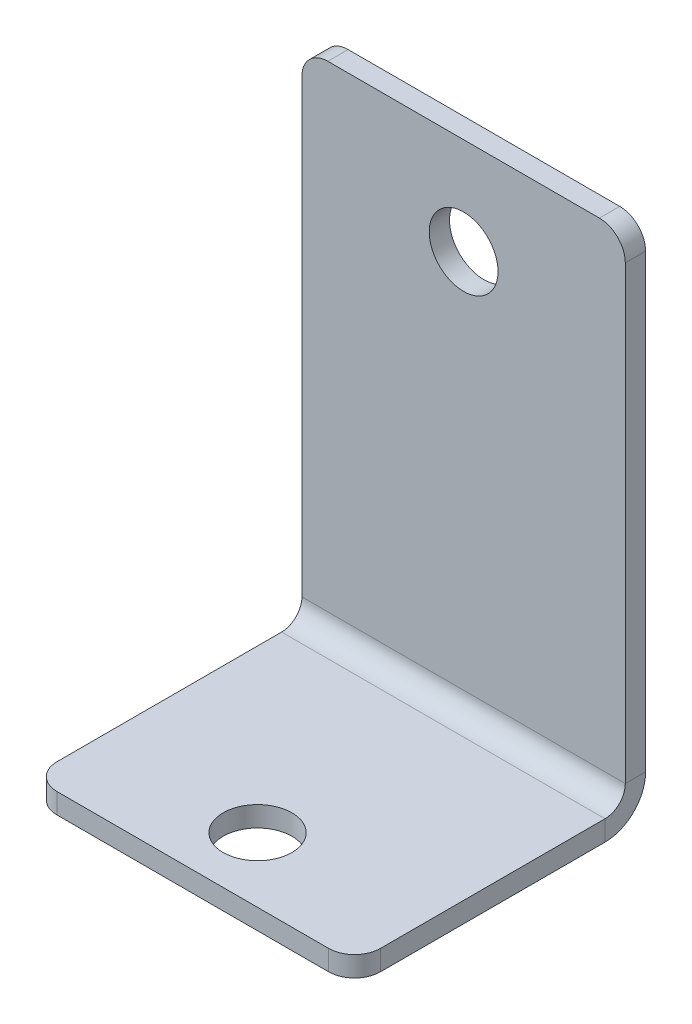
ISO-10303-21;
HEADER;
FILE_DESCRIPTION(('STEP AP214'),'2;1');
FILE_NAME('part.step','',(''),(''),'','','');
FILE_SCHEMA(('AUTOMOTIVE_DESIGN { 1 0 10303 214 1 1 1 1 }'));
ENDSEC;
DATA;
#1=APPLICATION_CONTEXT('core data for automotive mechanical design processes');
#2=APPLICATION_PROTOCOL_DEFINITION('international standard','automotive_design',2000,#1);
#3=PRODUCT_CONTEXT('',#1,'mechanical');
#4=PRODUCT('Part','Part','',(#3));
#5=PRODUCT_RELATED_PRODUCT_CATEGORY('part','',(#4));
#6=PRODUCT_DEFINITION_FORMATION('','',#4);
#7=PRODUCT_DEFINITION_CONTEXT('part definition',#1,'design');
#8=PRODUCT_DEFINITION('design','',#6,#7);
#9=PRODUCT_DEFINITION_SHAPE('','',#8);
#10=(LENGTH_UNIT() NAMED_UNIT(*) SI_UNIT(.MILLI.,.METRE.));
#11=(NAMED_UNIT(*) PLANE_ANGLE_UNIT() SI_UNIT($,.RADIAN.));
#12=(NAMED_UNIT(*) SI_UNIT($,.STERADIAN.) SOLID_ANGLE_UNIT());
#13=UNCERTAINTY_MEASURE_WITH_UNIT(LENGTH_MEASURE(1.E-05),#10,'distance_accuracy_value','');
#14=(GEOMETRIC_REPRESENTATION_CONTEXT(3) GLOBAL_UNCERTAINTY_ASSIGNED_CONTEXT((#13)) GLOBAL_UNIT_ASSIGNED_CONTEXT((#10,
#11,#12)) REPRESENTATION_CONTEXT('',''));
#15=CARTESIAN_POINT('',(0.,0.,0.));
#16=DIRECTION('',(0.,0.,1.));
#17=DIRECTION('',(1.,0.,0.));
#18=AXIS2_PLACEMENT_3D('',#15,#16,#17);
#19=CARTESIAN_POINT('',(31.75,0.,3.9878));
#20=DIRECTION('',(1.,0.,0.));
#21=DIRECTION('',(0.,0.,-1.));
#22=AXIS2_PLACEMENT_3D('',#19,#20,#21);
#23=PLANE('',#22);
#24=DIRECTION('',(0.,1.,0.));
#25=VECTOR('',#24,1.);
#26=CARTESIAN_POINT('',(31.75,0.,3.9878));
#27=LINE('',#26,#25);
#28=CARTESIAN_POINT('',(31.75,0.,3.9878));
#29=VERTEX_POINT('',#28);
#30=CARTESIAN_POINT('',(31.75,1.9939,3.9878));
#31=VERTEX_POINT('',#30);
#32=EDGE_CURVE('E141',#29,#31,#27,.T.);
#33=ORIENTED_EDGE('',*,*,#32,.F.);
#34=CARTESIAN_POINT('',(31.75,3.9878,3.9878));
#35=DIRECTION('',(-1.,0.,0.));
#36=DIRECTION('',(0.,0.,1.));
#37=AXIS2_PLACEMENT_3D('',#34,#35,#36);
#38=CIRCLE('',#37,3.9878);
#39=CARTESIAN_POINT('',(31.75,3.9878,0.));
#40=VERTEX_POINT('',#39);
#41=EDGE_CURVE('E138',#29,#40,#38,.F.);
#42=ORIENTED_EDGE('',*,*,#41,.T.);
#43=DIRECTION('',(0.,0.,-1.));
#44=VECTOR('',#43,1.);
#45=CARTESIAN_POINT('',(31.75,3.9878,1.9939));
#46=LINE('',#45,#44);
#47=CARTESIAN_POINT('',(31.75,3.9878,1.9939));
#48=VERTEX_POINT('',#47);
#49=EDGE_CURVE('E132',#48,#40,#46,.T.);
#50=ORIENTED_EDGE('',*,*,#49,.F.);
#51=CARTESIAN_POINT('',(31.75,3.9878,3.9878));
#52=DIRECTION('',(1.,0.,0.));
#53=DIRECTION('',(0.,0.,-1.));
#54=AXIS2_PLACEMENT_3D('',#51,#52,#53);
#55=CIRCLE('',#54,1.9939);
#56=EDGE_CURVE('E136',#31,#48,#55,.T.);
#57=ORIENTED_EDGE('',*,*,#56,.F.);
#58=EDGE_LOOP('',(#33,#42,#50,#57));
#59=FACE_BOUND('',#58,.T.);
#60=ADVANCED_FACE('F40',(#59),#23,.T.);
#61=CARTESIAN_POINT('',(31.75,3.9878,1.9939));
#62=DIRECTION('',(1.,0.,0.));
#63=DIRECTION('',(0.,0.,-1.));
#64=AXIS2_PLACEMENT_3D('',#61,#62,#63);
#65=PLANE('',#64);
#66=DIRECTION('',(0.,0.,-1.));
#67=VECTOR('',#66,1.);
#68=CARTESIAN_POINT('',(31.75,1.9939,28.575));
#69=LINE('',#68,#67);
#70=CARTESIAN_POINT('',(31.75,1.9939,26.035));
#71=VERTEX_POINT('',#70);
#72=EDGE_CURVE('E168',#71,#31,#69,.T.);
#73=ORIENTED_EDGE('',*,*,#72,.F.);
#74=DIRECTION('',(0.,1.,0.));
#75=VECTOR('',#74,1.);
#76=CARTESIAN_POINT('',(31.75,3.9878,26.035));
#77=LINE('',#76,#75);
#78=CARTESIAN_POINT('',(31.75,0.,26.035));
#79=VERTEX_POINT('',#78);
#80=EDGE_CURVE('E245',#71,#79,#77,.F.);
#81=ORIENTED_EDGE('',*,*,#80,.T.);
#82=DIRECTION('',(0.,0.,-1.));
#83=VECTOR('',#82,1.);
#84=CARTESIAN_POINT('',(31.75,0.,28.575));
#85=LINE('',#84,#83);
#86=EDGE_CURVE('E172',#79,#29,#85,.T.);
#87=ORIENTED_EDGE('',*,*,#86,.T.);
#88=ORIENTED_EDGE('',*,*,#32,.T.);
#89=EDGE_LOOP('',(#73,#81,#87,#88));
#90=FACE_BOUND('',#89,.T.);
#91=ADVANCED_FACE('F344',(#90),#65,.T.);
#92=CARTESIAN_POINT('',(0.,3.9878,0.));
#93=DIRECTION('',(-1.,0.,0.));
#94=DIRECTION('',(0.,0.,1.));
#95=AXIS2_PLACEMENT_3D('',#92,#93,#94);
#96=PLANE('',#95);
#97=DIRECTION('',(0.,0.,1.));
#98=VECTOR('',#97,1.);
#99=CARTESIAN_POINT('',(0.,3.9878,0.));
#100=LINE('',#99,#98);
#101=CARTESIAN_POINT('',(0.,3.9878,0.));
#102=VERTEX_POINT('',#101);
#103=CARTESIAN_POINT('',(0.,3.9878,1.9939));
#104=VERTEX_POINT('',#103);
#105=EDGE_CURVE('E142',#102,#104,#100,.T.);
#106=ORIENTED_EDGE('',*,*,#105,.F.);
#107=CARTESIAN_POINT('',(0.,3.9878,3.9878));
#108=DIRECTION('',(-1.,0.,0.));
#109=DIRECTION('',(0.,0.,1.));
#110=AXIS2_PLACEMENT_3D('',#107,#108,#109);
#111=CIRCLE('',#110,3.9878);
#112=CARTESIAN_POINT('',(0.,0.,3.9878));
#113=VERTEX_POINT('',#112);
#114=EDGE_CURVE('E197',#113,#102,#111,.F.);
#115=ORIENTED_EDGE('',*,*,#114,.F.);
#116=DIRECTION('',(0.,-1.,0.));
#117=VECTOR('',#116,1.);
#118=CARTESIAN_POINT('',(0.,1.9939,3.9878));
#119=LINE('',#118,#117);
#120=CARTESIAN_POINT('',(0.,1.9939,3.9878));
#121=VERTEX_POINT('',#120);
#122=EDGE_CURVE('E223',#121,#113,#119,.T.);
#123=ORIENTED_EDGE('',*,*,#122,.F.);
#124=CARTESIAN_POINT('',(0.,3.9878,3.9878));
#125=DIRECTION('',(1.,0.,0.));
#126=DIRECTION('',(0.,0.,-1.));
#127=AXIS2_PLACEMENT_3D('',#124,#125,#126);
#128=CIRCLE('',#127,1.9939);
#129=EDGE_CURVE('E188',#121,#104,#128,.T.);
#130=ORIENTED_EDGE('',*,*,#129,.T.);
#131=EDGE_LOOP('',(#106,#115,#123,#130));
#132=FACE_BOUND('',#131,.T.);
#133=ADVANCED_FACE('F342',(#132),#96,.T.);
#134=CARTESIAN_POINT('',(0.,1.9939,3.9878));
#135=DIRECTION('',(-1.,0.,0.));
#136=DIRECTION('',(0.,0.,1.));
#137=AXIS2_PLACEMENT_3D('',#134,#135,#136);
#138=PLANE('',#137);
#139=DIRECTION('',(0.,1.,0.));
#140=VECTOR('',#139,1.);
#141=CARTESIAN_POINT('',(0.,0.,1.9939));
#142=LINE('',#141,#140);
#143=CARTESIAN_POINT('',(0.,48.26,1.9939));
#144=VERTEX_POINT('',#143);
#145=EDGE_CURVE('E152',#104,#144,#142,.T.);
#146=ORIENTED_EDGE('',*,*,#145,.T.);
#147=DIRECTION('',(0.,0.,-1.));
#148=VECTOR('',#147,1.);
#149=CARTESIAN_POINT('',(0.,48.26,3.9878));
#150=LINE('',#149,#148);
#151=CARTESIAN_POINT('',(0.,48.26,0.));
#152=VERTEX_POINT('',#151);
#153=EDGE_CURVE('E258',#144,#152,#150,.T.);
#154=ORIENTED_EDGE('',*,*,#153,.T.);
#155=DIRECTION('',(0.,1.,0.));
#156=VECTOR('',#155,1.);
#157=CARTESIAN_POINT('',(0.,0.,0.));
#158=LINE('',#157,#156);
#159=EDGE_CURVE('E181',#102,#152,#158,.T.);
#160=ORIENTED_EDGE('',*,*,#159,.F.);
#161=ORIENTED_EDGE('',*,*,#105,.T.);
#162=EDGE_LOOP('',(#146,#154,#160,#161));
#163=FACE_BOUND('',#162,.T.);
#164=ADVANCED_FACE('F282',(#163),#138,.T.);
#165=CARTESIAN_POINT('',(31.75,0.,0.));
#166=DIRECTION('',(0.,0.,1.));
#167=DIRECTION('',(1.,0.,0.));
#168=AXIS2_PLACEMENT_3D('',#165,#166,#167);
#169=PLANE('',#168);
#170=CARTESIAN_POINT('',(15.875,41.275,0.));
#171=DIRECTION('',(0.,0.,1.));
#172=DIRECTION('',(1.,0.,0.));
#173=AXIS2_PLACEMENT_3D('',#170,#171,#172);
#174=CIRCLE('',#173,3.37819999999993);
#175=CARTESIAN_POINT('',(19.2531999999999,41.275,0.));
#176=VERTEX_POINT('',#175);
#177=EDGE_CURVE('E185',#176,#176,#174,.T.);
#178=ORIENTED_EDGE('',*,*,#177,.T.);
#179=EDGE_LOOP('',(#178));
#180=FACE_BOUND('',#179,.T.);
#181=ORIENTED_EDGE('',*,*,#159,.T.);
#182=CARTESIAN_POINT('',(2.54,48.26,0.));
#183=DIRECTION('',(0.,0.,1.));
#184=DIRECTION('',(1.,0.,0.));
#185=AXIS2_PLACEMENT_3D('',#182,#183,#184);
#186=CIRCLE('',#185,2.54);
#187=CARTESIAN_POINT('',(2.54,50.8,0.));
#188=VERTEX_POINT('',#187);
#189=EDGE_CURVE('E265',#152,#188,#186,.F.);
#190=ORIENTED_EDGE('',*,*,#189,.T.);
#191=DIRECTION('',(-1.,0.,0.));
#192=VECTOR('',#191,1.);
#193=CARTESIAN_POINT('',(31.75,50.8,0.));
#194=LINE('',#193,#192);
#195=CARTESIAN_POINT('',(29.21,50.8,0.));
#196=VERTEX_POINT('',#195);
#197=EDGE_CURVE('E220',#196,#188,#194,.T.);
#198=ORIENTED_EDGE('',*,*,#197,.F.);
#199=CARTESIAN_POINT('',(29.21,48.26,0.));
#200=DIRECTION('',(0.,0.,1.));
#201=DIRECTION('',(1.,0.,0.));
#202=AXIS2_PLACEMENT_3D('',#199,#200,#201);
#203=CIRCLE('',#202,2.54);
#204=CARTESIAN_POINT('',(31.75,48.26,0.));
#205=VERTEX_POINT('',#204);
#206=EDGE_CURVE('E262',#196,#205,#203,.F.);
#207=ORIENTED_EDGE('',*,*,#206,.T.);
#208=DIRECTION('',(0.,1.,0.));
#209=VECTOR('',#208,1.);
#210=CARTESIAN_POINT('',(31.75,0.,0.));
#211=LINE('',#210,#209);
#212=EDGE_CURVE('E162',#40,#205,#211,.T.);
#213=ORIENTED_EDGE('',*,*,#212,.F.);
#214=DIRECTION('',(-1.,0.,0.));
#215=VECTOR('',#214,1.);
#216=CARTESIAN_POINT('',(31.75,3.9878,0.));
#217=LINE('',#216,#215);
#218=EDGE_CURVE('E180',#40,#102,#217,.T.);
#219=ORIENTED_EDGE('',*,*,#218,.T.);
#220=EDGE_LOOP('',(#181,#190,#198,#207,#213,#219));
#221=FACE_BOUND('',#220,.T.);
#222=ADVANCED_FACE('F287',(#180,#221),#169,.F.);
#223=CARTESIAN_POINT('',(31.75,50.8,1.9939));
#224=DIRECTION('',(0.,1.,0.));
#225=DIRECTION('',(0.,0.,1.));
#226=AXIS2_PLACEMENT_3D('',#223,#224,#225);
#227=PLANE('',#226);
#228=ORIENTED_EDGE('',*,*,#197,.T.);
#229=DIRECTION('',(0.,0.,-1.));
#230=VECTOR('',#229,1.);
#231=CARTESIAN_POINT('',(2.54,50.8,1.9939));
#232=LINE('',#231,#230);
#233=CARTESIAN_POINT('',(2.54,50.8,1.9939));
#234=VERTEX_POINT('',#233);
#235=EDGE_CURVE('E62',#188,#234,#232,.F.);
#236=ORIENTED_EDGE('',*,*,#235,.T.);
#237=DIRECTION('',(-1.,0.,0.));
#238=VECTOR('',#237,1.);
#239=CARTESIAN_POINT('',(31.75,50.8,1.9939));
#240=LINE('',#239,#238);
#241=CARTESIAN_POINT('',(29.21,50.8,1.9939));
#242=VERTEX_POINT('',#241);
#243=EDGE_CURVE('E157',#242,#234,#240,.T.);
#244=ORIENTED_EDGE('',*,*,#243,.F.);
#245=DIRECTION('',(0.,0.,-1.));
#246=VECTOR('',#245,1.);
#247=CARTESIAN_POINT('',(29.21,50.8,1.9939));
#248=LINE('',#247,#246);
#249=EDGE_CURVE('E268',#242,#196,#248,.T.);
#250=ORIENTED_EDGE('',*,*,#249,.T.);
#251=EDGE_LOOP('',(#228,#236,#244,#250));
#252=FACE_BOUND('',#251,.T.);
#253=ADVANCED_FACE('F288',(#252),#227,.T.);
#254=CARTESIAN_POINT('',(31.75,0.,1.9939));
#255=DIRECTION('',(0.,0.,1.));
#256=DIRECTION('',(1.,0.,0.));
#257=AXIS2_PLACEMENT_3D('',#254,#255,#256);
#258=PLANE('',#257);
#259=CARTESIAN_POINT('',(15.875,41.275,1.9939));
#260=DIRECTION('',(0.,0.,1.));
#261=DIRECTION('',(1.,0.,0.));
#262=AXIS2_PLACEMENT_3D('',#259,#260,#261);
#263=CIRCLE('',#262,3.37819999999993);
#264=CARTESIAN_POINT('',(19.2531999999999,41.275,1.9939));
#265=VERTEX_POINT('',#264);
#266=EDGE_CURVE('E298',#265,#265,#263,.T.);
#267=ORIENTED_EDGE('',*,*,#266,.F.);
#268=EDGE_LOOP('',(#267));
#269=FACE_BOUND('',#268,.T.);
#270=ORIENTED_EDGE('',*,*,#243,.T.);
#271=CARTESIAN_POINT('',(2.54,48.26,1.9939));
#272=DIRECTION('',(0.,0.,1.));
#273=DIRECTION('',(1.,0.,0.));
#274=AXIS2_PLACEMENT_3D('',#271,#272,#273);
#275=CIRCLE('',#274,2.54);
#276=EDGE_CURVE('E49',#234,#144,#275,.T.);
#277=ORIENTED_EDGE('',*,*,#276,.T.);
#278=ORIENTED_EDGE('',*,*,#145,.F.);
#279=DIRECTION('',(-1.,0.,0.));
#280=VECTOR('',#279,1.);
#281=CARTESIAN_POINT('',(31.75,3.9878,1.9939));
#282=LINE('',#281,#280);
#283=EDGE_CURVE('E147',#48,#104,#282,.T.);
#284=ORIENTED_EDGE('',*,*,#283,.F.);
#285=DIRECTION('',(0.,1.,0.));
#286=VECTOR('',#285,1.);
#287=CARTESIAN_POINT('',(31.75,0.,1.9939));
#288=LINE('',#287,#286);
#289=CARTESIAN_POINT('',(31.75,48.26,1.9939));
#290=VERTEX_POINT('',#289);
#291=EDGE_CURVE('E149',#48,#290,#288,.T.);
#292=ORIENTED_EDGE('',*,*,#291,.T.);
#293=CARTESIAN_POINT('',(29.21,48.26,1.9939));
#294=DIRECTION('',(0.,0.,1.));
#295=DIRECTION('',(1.,0.,0.));
#296=AXIS2_PLACEMENT_3D('',#293,#294,#295);
#297=CIRCLE('',#296,2.54);
#298=EDGE_CURVE('E274',#290,#242,#297,.T.);
#299=ORIENTED_EDGE('',*,*,#298,.T.);
#300=EDGE_LOOP('',(#270,#277,#278,#284,#292,#299));
#301=FACE_BOUND('',#300,.T.);
#302=ADVANCED_FACE('F148',(#269,#301),#258,.T.);
#303=CARTESIAN_POINT('',(31.75,3.9878,3.9878));
#304=DIRECTION('',(-1.,0.,0.));
#305=DIRECTION('',(0.,0.,1.));
#306=AXIS2_PLACEMENT_3D('',#303,#304,#305);
#307=CYLINDRICAL_SURFACE('',#306,1.9939);
#308=ORIENTED_EDGE('',*,*,#129,.F.);
#309=DIRECTION('',(-1.,0.,0.));
#310=VECTOR('',#309,1.);
#311=CARTESIAN_POINT('',(31.75,1.9939,3.9878));
#312=LINE('',#311,#310);
#313=EDGE_CURVE('E158',#31,#121,#312,.T.);
#314=ORIENTED_EDGE('',*,*,#313,.F.);
#315=ORIENTED_EDGE('',*,*,#56,.T.);
#316=ORIENTED_EDGE('',*,*,#283,.T.);
#317=EDGE_LOOP('',(#308,#314,#315,#316));
#318=FACE_BOUND('',#317,.T.);
#319=ADVANCED_FACE('F165',(#318),#307,.F.);
#320=CARTESIAN_POINT('',(31.75,1.9939,28.575));
#321=DIRECTION('',(0.,1.,0.));
#322=DIRECTION('',(0.,0.,1.));
#323=AXIS2_PLACEMENT_3D('',#320,#321,#322);
#324=PLANE('',#323);
#325=CARTESIAN_POINT('',(15.875,1.9939,22.225));
#326=DIRECTION('',(0.,1.,0.));
#327=DIRECTION('',(0.,0.,1.));
#328=AXIS2_PLACEMENT_3D('',#325,#326,#327);
#329=CIRCLE('',#328,3.37819999999999);
#330=CARTESIAN_POINT('',(15.875,1.9939,25.6032));
#331=VERTEX_POINT('',#330);
#332=EDGE_CURVE('E306',#331,#331,#329,.T.);
#333=ORIENTED_EDGE('',*,*,#332,.F.);
#334=EDGE_LOOP('',(#333));
#335=FACE_BOUND('',#334,.T.);
#336=DIRECTION('',(-1.,0.,0.));
#337=VECTOR('',#336,1.);
#338=CARTESIAN_POINT('',(31.75,1.9939,28.575));
#339=LINE('',#338,#337);
#340=CARTESIAN_POINT('',(29.21,1.9939,28.575));
#341=VERTEX_POINT('',#340);
#342=CARTESIAN_POINT('',(2.54,1.9939,28.575));
#343=VERTEX_POINT('',#342);
#344=EDGE_CURVE('E212',#341,#343,#339,.T.);
#345=ORIENTED_EDGE('',*,*,#344,.F.);
#346=CARTESIAN_POINT('',(29.21,1.9939,26.035));
#347=DIRECTION('',(0.,1.,0.));
#348=DIRECTION('',(0.,0.,1.));
#349=AXIS2_PLACEMENT_3D('',#346,#347,#348);
#350=CIRCLE('',#349,2.54);
#351=EDGE_CURVE('E242',#341,#71,#350,.T.);
#352=ORIENTED_EDGE('',*,*,#351,.T.);
#353=ORIENTED_EDGE('',*,*,#72,.T.);
#354=ORIENTED_EDGE('',*,*,#313,.T.);
#355=DIRECTION('',(0.,0.,-1.));
#356=VECTOR('',#355,1.);
#357=CARTESIAN_POINT('',(0.,1.9939,28.575));
#358=LINE('',#357,#356);
#359=CARTESIAN_POINT('',(0.,1.9939,26.035));
#360=VERTEX_POINT('',#359);
#361=EDGE_CURVE('E191',#360,#121,#358,.T.);
#362=ORIENTED_EDGE('',*,*,#361,.F.);
#363=CARTESIAN_POINT('',(2.54,1.9939,26.035));
#364=DIRECTION('',(0.,1.,0.));
#365=DIRECTION('',(0.,0.,1.));
#366=AXIS2_PLACEMENT_3D('',#363,#364,#365);
#367=CIRCLE('',#366,2.54);
#368=EDGE_CURVE('E239',#360,#343,#367,.T.);
#369=ORIENTED_EDGE('',*,*,#368,.T.);
#370=EDGE_LOOP('',(#345,#352,#353,#354,#362,#369));
#371=FACE_BOUND('',#370,.T.);
#372=ADVANCED_FACE('F314',(#335,#371),#324,.T.);
#373=CARTESIAN_POINT('',(31.75,0.,28.575));
#374=DIRECTION('',(0.,0.,1.));
#375=DIRECTION('',(1.,0.,0.));
#376=AXIS2_PLACEMENT_3D('',#373,#374,#375);
#377=PLANE('',#376);
#378=DIRECTION('',(-1.,0.,0.));
#379=VECTOR('',#378,1.);
#380=CARTESIAN_POINT('',(31.75,0.,28.575));
#381=LINE('',#380,#379);
#382=CARTESIAN_POINT('',(29.21,0.,28.575));
#383=VERTEX_POINT('',#382);
#384=CARTESIAN_POINT('',(2.54,0.,28.575));
#385=VERTEX_POINT('',#384);
#386=EDGE_CURVE('E208',#383,#385,#381,.T.);
#387=ORIENTED_EDGE('',*,*,#386,.F.);
#388=DIRECTION('',(0.,1.,0.));
#389=VECTOR('',#388,1.);
#390=CARTESIAN_POINT('',(29.21,0.,28.575));
#391=LINE('',#390,#389);
#392=EDGE_CURVE('E235',#383,#341,#391,.T.);
#393=ORIENTED_EDGE('',*,*,#392,.T.);
#394=ORIENTED_EDGE('',*,*,#344,.T.);
#395=DIRECTION('',(0.,1.,0.));
#396=VECTOR('',#395,1.);
#397=CARTESIAN_POINT('',(2.54,0.,28.575));
#398=LINE('',#397,#396);
#399=EDGE_CURVE('E232',#343,#385,#398,.F.);
#400=ORIENTED_EDGE('',*,*,#399,.T.);
#401=EDGE_LOOP('',(#387,#393,#394,#400));
#402=FACE_BOUND('',#401,.T.);
#403=ADVANCED_FACE('F317',(#402),#377,.T.);
#404=CARTESIAN_POINT('',(31.75,0.,28.575));
#405=DIRECTION('',(0.,1.,0.));
#406=DIRECTION('',(0.,0.,1.));
#407=AXIS2_PLACEMENT_3D('',#404,#405,#406);
#408=PLANE('',#407);
#409=CARTESIAN_POINT('',(15.875,0.,22.225));
#410=DIRECTION('',(0.,1.,0.));
#411=DIRECTION('',(0.,0.,1.));
#412=AXIS2_PLACEMENT_3D('',#409,#410,#411);
#413=CIRCLE('',#412,3.37819999999993);
#414=CARTESIAN_POINT('',(15.875,0.,25.6031999999999));
#415=VERTEX_POINT('',#414);
#416=EDGE_CURVE('E302',#415,#415,#413,.T.);
#417=ORIENTED_EDGE('',*,*,#416,.T.);
#418=EDGE_LOOP('',(#417));
#419=FACE_BOUND('',#418,.T.);
#420=ORIENTED_EDGE('',*,*,#86,.F.);
#421=CARTESIAN_POINT('',(29.21,0.,26.035));
#422=DIRECTION('',(0.,1.,0.));
#423=DIRECTION('',(0.,0.,1.));
#424=AXIS2_PLACEMENT_3D('',#421,#422,#423);
#425=CIRCLE('',#424,2.54);
#426=EDGE_CURVE('E251',#79,#383,#425,.F.);
#427=ORIENTED_EDGE('',*,*,#426,.T.);
#428=ORIENTED_EDGE('',*,*,#386,.T.);
#429=CARTESIAN_POINT('',(2.54,0.,26.035));
#430=DIRECTION('',(0.,1.,0.));
#431=DIRECTION('',(0.,0.,1.));
#432=AXIS2_PLACEMENT_3D('',#429,#430,#431);
#433=CIRCLE('',#432,2.54);
#434=CARTESIAN_POINT('',(0.,0.,26.035));
#435=VERTEX_POINT('',#434);
#436=EDGE_CURVE('E248',#385,#435,#433,.F.);
#437=ORIENTED_EDGE('',*,*,#436,.T.);
#438=DIRECTION('',(0.,0.,-1.));
#439=VECTOR('',#438,1.);
#440=CARTESIAN_POINT('',(0.,0.,28.575));
#441=LINE('',#440,#439);
#442=EDGE_CURVE('E194',#435,#113,#441,.T.);
#443=ORIENTED_EDGE('',*,*,#442,.T.);
#444=DIRECTION('',(-1.,0.,0.));
#445=VECTOR('',#444,1.);
#446=CARTESIAN_POINT('',(31.75,0.,3.9878));
#447=LINE('',#446,#445);
#448=EDGE_CURVE('E204',#29,#113,#447,.T.);
#449=ORIENTED_EDGE('',*,*,#448,.F.);
#450=EDGE_LOOP('',(#420,#427,#428,#437,#443,#449));
#451=FACE_BOUND('',#450,.T.);
#452=ADVANCED_FACE('F333',(#419,#451),#408,.F.);
#453=CARTESIAN_POINT('',(31.75,3.9878,3.9878));
#454=DIRECTION('',(-1.,0.,0.));
#455=DIRECTION('',(0.,0.,1.));
#456=AXIS2_PLACEMENT_3D('',#453,#454,#455);
#457=CYLINDRICAL_SURFACE('',#456,3.9878);
#458=ORIENTED_EDGE('',*,*,#114,.T.);
#459=ORIENTED_EDGE('',*,*,#218,.F.);
#460=ORIENTED_EDGE('',*,*,#41,.F.);
#461=ORIENTED_EDGE('',*,*,#448,.T.);
#462=EDGE_LOOP('',(#458,#459,#460,#461));
#463=FACE_BOUND('',#462,.T.);
#464=ADVANCED_FACE('F341',(#463),#457,.T.);
#465=CARTESIAN_POINT('',(31.75,3.9878,3.9878));
#466=DIRECTION('',(1.,0.,0.));
#467=DIRECTION('',(0.,0.,-1.));
#468=AXIS2_PLACEMENT_3D('',#465,#466,#467);
#469=PLANE('',#468);
#470=ORIENTED_EDGE('',*,*,#212,.T.);
#471=DIRECTION('',(0.,0.,-1.));
#472=VECTOR('',#471,1.);
#473=CARTESIAN_POINT('',(31.75,48.26,3.9878));
#474=LINE('',#473,#472);
#475=EDGE_CURVE('E11',#205,#290,#474,.F.);
#476=ORIENTED_EDGE('',*,*,#475,.T.);
#477=ORIENTED_EDGE('',*,*,#291,.F.);
#478=ORIENTED_EDGE('',*,*,#49,.T.);
#479=EDGE_LOOP('',(#470,#476,#477,#478));
#480=FACE_BOUND('',#479,.T.);
#481=ADVANCED_FACE('F160',(#480),#469,.T.);
#482=CARTESIAN_POINT('',(0.,3.9878,3.9878));
#483=DIRECTION('',(1.,0.,0.));
#484=DIRECTION('',(0.,0.,-1.));
#485=AXIS2_PLACEMENT_3D('',#482,#483,#484);
#486=PLANE('',#485);
#487=ORIENTED_EDGE('',*,*,#442,.F.);
#488=DIRECTION('',(0.,1.,0.));
#489=VECTOR('',#488,1.);
#490=CARTESIAN_POINT('',(0.,1.9939,26.035));
#491=LINE('',#490,#489);
#492=EDGE_CURVE('E254',#435,#360,#491,.T.);
#493=ORIENTED_EDGE('',*,*,#492,.T.);
#494=ORIENTED_EDGE('',*,*,#361,.T.);
#495=ORIENTED_EDGE('',*,*,#122,.T.);
#496=EDGE_LOOP('',(#487,#493,#494,#495));
#497=FACE_BOUND('',#496,.T.);
#498=ADVANCED_FACE('F336',(#497),#486,.F.);
#499=CARTESIAN_POINT('',(15.875,41.275,1.9939));
#500=DIRECTION('',(0.,0.,1.));
#501=DIRECTION('',(1.,0.,0.));
#502=AXIS2_PLACEMENT_3D('',#499,#500,#501);
#503=CYLINDRICAL_SURFACE('',#502,3.37819999999993);
#504=ORIENTED_EDGE('',*,*,#177,.F.);
#505=EDGE_LOOP('',(#504));
#506=FACE_BOUND('',#505,.T.);
#507=ORIENTED_EDGE('',*,*,#266,.T.);
#508=EDGE_LOOP('',(#507));
#509=FACE_BOUND('',#508,.T.);
#510=ADVANCED_FACE('F395',(#506,#509),#503,.F.);
#511=CARTESIAN_POINT('',(15.875,1.9939,22.225));
#512=DIRECTION('',(0.,1.,0.));
#513=DIRECTION('',(0.,0.,1.));
#514=AXIS2_PLACEMENT_3D('',#511,#512,#513);
#515=CYLINDRICAL_SURFACE('',#514,3.37819999999996);
#516=ORIENTED_EDGE('',*,*,#416,.F.);
#517=EDGE_LOOP('',(#516));
#518=FACE_BOUND('',#517,.T.);
#519=ORIENTED_EDGE('',*,*,#332,.T.);
#520=EDGE_LOOP('',(#519));
#521=FACE_BOUND('',#520,.T.);
#522=ADVANCED_FACE('F312',(#518,#521),#515,.F.);
#523=CARTESIAN_POINT('',(29.21,0.,26.035));
#524=DIRECTION('',(0.,1.,0.));
#525=DIRECTION('',(0.,0.,1.));
#526=AXIS2_PLACEMENT_3D('',#523,#524,#525);
#527=CYLINDRICAL_SURFACE('',#526,2.54);
#528=ORIENTED_EDGE('',*,*,#426,.F.);
#529=ORIENTED_EDGE('',*,*,#80,.F.);
#530=ORIENTED_EDGE('',*,*,#351,.F.);
#531=ORIENTED_EDGE('',*,*,#392,.F.);
#532=EDGE_LOOP('',(#528,#529,#530,#531));
#533=FACE_BOUND('',#532,.T.);
#534=ADVANCED_FACE('F358',(#533),#527,.T.);
#535=CARTESIAN_POINT('',(2.54,3.9878,26.035));
#536=DIRECTION('',(0.,-1.,0.));
#537=DIRECTION('',(0.,0.,-1.));
#538=AXIS2_PLACEMENT_3D('',#535,#536,#537);
#539=CYLINDRICAL_SURFACE('',#538,2.54);
#540=ORIENTED_EDGE('',*,*,#436,.F.);
#541=ORIENTED_EDGE('',*,*,#399,.F.);
#542=ORIENTED_EDGE('',*,*,#368,.F.);
#543=ORIENTED_EDGE('',*,*,#492,.F.);
#544=EDGE_LOOP('',(#540,#541,#542,#543));
#545=FACE_BOUND('',#544,.T.);
#546=ADVANCED_FACE('F328',(#545),#539,.T.);
#547=CARTESIAN_POINT('',(2.54,48.26,3.9878));
#548=DIRECTION('',(0.,0.,-1.));
#549=DIRECTION('',(-1.,0.,0.));
#550=AXIS2_PLACEMENT_3D('',#547,#548,#549);
#551=CYLINDRICAL_SURFACE('',#550,2.54);
#552=ORIENTED_EDGE('',*,*,#276,.F.);
#553=ORIENTED_EDGE('',*,*,#235,.F.);
#554=ORIENTED_EDGE('',*,*,#189,.F.);
#555=ORIENTED_EDGE('',*,*,#153,.F.);
#556=EDGE_LOOP('',(#552,#553,#554,#555));
#557=FACE_BOUND('',#556,.T.);
#558=ADVANCED_FACE('F284',(#557),#551,.T.);
#559=CARTESIAN_POINT('',(29.21,48.26,1.9939));
#560=DIRECTION('',(0.,0.,-1.));
#561=DIRECTION('',(-1.,0.,0.));
#562=AXIS2_PLACEMENT_3D('',#559,#560,#561);
#563=CYLINDRICAL_SURFACE('',#562,2.54);
#564=ORIENTED_EDGE('',*,*,#298,.F.);
#565=ORIENTED_EDGE('',*,*,#475,.F.);
#566=ORIENTED_EDGE('',*,*,#206,.F.);
#567=ORIENTED_EDGE('',*,*,#249,.F.);
#568=EDGE_LOOP('',(#564,#565,#566,#567));
#569=FACE_BOUND('',#568,.T.);
#570=ADVANCED_FACE('F42',(#569),#563,.T.);
#571=CLOSED_SHELL('',(#60,#91,#133,#164,#222,#253,#302,#319,#372,#403,#452,#464,#481,#498,#510,
#522,#534,#546,#558,#570));
#572=MANIFOLD_SOLID_BREP('B2',#571);
#573=ADVANCED_BREP_SHAPE_REPRESENTATION('',(#18,#572),#14);
#574=SHAPE_DEFINITION_REPRESENTATION(#9,#573);
ENDSEC;
END-ISO-10303-21;
